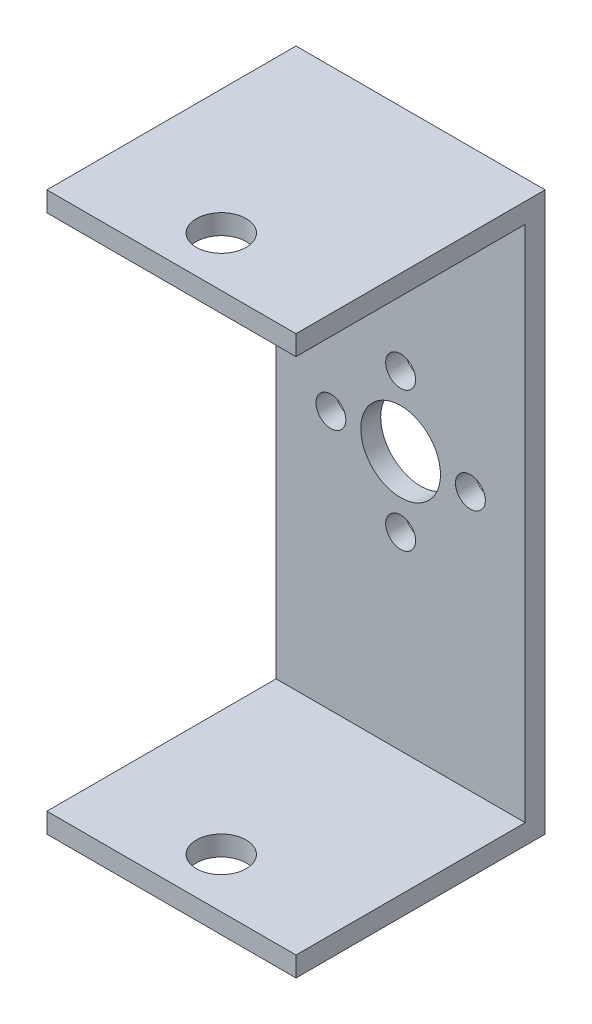
ISO-10303-21;
HEADER;
FILE_DESCRIPTION(('STEP AP214'),'2;1');
FILE_NAME('part.step','',(''),(''),'','','');
FILE_SCHEMA(('AUTOMOTIVE_DESIGN { 1 0 10303 214 1 1 1 1 }'));
ENDSEC;
DATA;
#1=APPLICATION_CONTEXT('core data for automotive mechanical design processes');
#2=APPLICATION_PROTOCOL_DEFINITION('international standard','automotive_design',2000,#1);
#3=PRODUCT_CONTEXT('',#1,'mechanical');
#4=PRODUCT('Part','Part','',(#3));
#5=PRODUCT_RELATED_PRODUCT_CATEGORY('part','',(#4));
#6=PRODUCT_DEFINITION_FORMATION('','',#4);
#7=PRODUCT_DEFINITION_CONTEXT('part definition',#1,'design');
#8=PRODUCT_DEFINITION('design','',#6,#7);
#9=PRODUCT_DEFINITION_SHAPE('','',#8);
#10=(LENGTH_UNIT() NAMED_UNIT(*) SI_UNIT(.MILLI.,.METRE.));
#11=(NAMED_UNIT(*) PLANE_ANGLE_UNIT() SI_UNIT($,.RADIAN.));
#12=(NAMED_UNIT(*) SI_UNIT($,.STERADIAN.) SOLID_ANGLE_UNIT());
#13=UNCERTAINTY_MEASURE_WITH_UNIT(LENGTH_MEASURE(1.E-05),#10,'distance_accuracy_value','');
#14=(GEOMETRIC_REPRESENTATION_CONTEXT(3) GLOBAL_UNCERTAINTY_ASSIGNED_CONTEXT((#13)) GLOBAL_UNIT_ASSIGNED_CONTEXT((#10,
#11,#12)) REPRESENTATION_CONTEXT('',''));
#15=CARTESIAN_POINT('',(0.,0.,0.));
#16=DIRECTION('',(0.,0.,1.));
#17=DIRECTION('',(1.,0.,0.));
#18=AXIS2_PLACEMENT_3D('',#15,#16,#17);
#19=CARTESIAN_POINT('',(-12.6747704507397,30.5029426241211,2.));
#20=DIRECTION('',(1.,0.,0.));
#21=DIRECTION('',(0.,1.,0.));
#22=AXIS2_PLACEMENT_3D('',#19,#20,#21);
#23=PLANE('',#22);
#24=DIRECTION('',(0.,-1.,0.));
#25=VECTOR('',#24,1.);
#26=CARTESIAN_POINT('',(-12.6747704507397,30.5029426241211,0.));
#27=LINE('',#26,#25);
#28=CARTESIAN_POINT('',(-12.6747704507397,32.5029426241211,0.));
#29=VERTEX_POINT('',#28);
#30=CARTESIAN_POINT('',(-12.6747704507397,-23.4970573758789,0.));
#31=VERTEX_POINT('',#30);
#32=EDGE_CURVE('E148',#29,#31,#27,.T.);
#33=ORIENTED_EDGE('',*,*,#32,.T.);
#34=DIRECTION('',(0.,0.,-1.));
#35=VECTOR('',#34,1.);
#36=CARTESIAN_POINT('',(-12.6747704507397,-23.4970573758789,0.));
#37=LINE('',#36,#35);
#38=CARTESIAN_POINT('',(-12.6747704507397,-23.4970573758789,25.));
#39=VERTEX_POINT('',#38);
#40=EDGE_CURVE('E107',#39,#31,#37,.T.);
#41=ORIENTED_EDGE('',*,*,#40,.F.);
#42=DIRECTION('',(0.,1.,0.));
#43=VECTOR('',#42,1.);
#44=CARTESIAN_POINT('',(-12.6747704507397,-23.4970573758789,25.));
#45=LINE('',#44,#43);
#46=CARTESIAN_POINT('',(-12.6747704507397,-21.4970573758789,25.));
#47=VERTEX_POINT('',#46);
#48=EDGE_CURVE('E103',#39,#47,#45,.T.);
#49=ORIENTED_EDGE('',*,*,#48,.T.);
#50=DIRECTION('',(0.,0.,-1.));
#51=VECTOR('',#50,1.);
#52=CARTESIAN_POINT('',(-12.6747704507397,-21.4970573758789,0.));
#53=LINE('',#52,#51);
#54=CARTESIAN_POINT('',(-12.6747704507397,-21.4970573758789,2.));
#55=VERTEX_POINT('',#54);
#56=EDGE_CURVE('E116',#47,#55,#53,.T.);
#57=ORIENTED_EDGE('',*,*,#56,.T.);
#58=DIRECTION('',(0.,-1.,0.));
#59=VECTOR('',#58,1.);
#60=CARTESIAN_POINT('',(-12.6747704507397,30.5029426241211,2.));
#61=LINE('',#60,#59);
#62=CARTESIAN_POINT('',(-12.6747704507397,30.5029426241211,2.));
#63=VERTEX_POINT('',#62);
#64=EDGE_CURVE('E141',#63,#55,#61,.T.);
#65=ORIENTED_EDGE('',*,*,#64,.F.);
#66=DIRECTION('',(0.,0.,1.));
#67=VECTOR('',#66,1.);
#68=CARTESIAN_POINT('',(-12.6747704507397,30.5029426241211,0.));
#69=LINE('',#68,#67);
#70=CARTESIAN_POINT('',(-12.6747704507397,30.5029426241211,25.));
#71=VERTEX_POINT('',#70);
#72=EDGE_CURVE('E48',#63,#71,#69,.T.);
#73=ORIENTED_EDGE('',*,*,#72,.T.);
#74=DIRECTION('',(0.,-1.,0.));
#75=VECTOR('',#74,1.);
#76=CARTESIAN_POINT('',(-12.6747704507397,32.5029426241211,25.));
#77=LINE('',#76,#75);
#78=CARTESIAN_POINT('',(-12.6747704507397,32.5029426241211,25.));
#79=VERTEX_POINT('',#78);
#80=EDGE_CURVE('E163',#79,#71,#77,.T.);
#81=ORIENTED_EDGE('',*,*,#80,.F.);
#82=DIRECTION('',(0.,0.,1.));
#83=VECTOR('',#82,1.);
#84=CARTESIAN_POINT('',(-12.6747704507397,32.5029426241211,0.));
#85=LINE('',#84,#83);
#86=EDGE_CURVE('E181',#29,#79,#85,.T.);
#87=ORIENTED_EDGE('',*,*,#86,.F.);
#88=EDGE_LOOP('',(#33,#41,#49,#57,#65,#73,#81,#87));
#89=FACE_BOUND('',#88,.T.);
#90=ADVANCED_FACE('F32',(#89),#23,.F.);
#91=CARTESIAN_POINT('',(12.3252295492603,30.5029426241211,2.));
#92=DIRECTION('',(-1.,0.,0.));
#93=DIRECTION('',(0.,-1.,0.));
#94=AXIS2_PLACEMENT_3D('',#91,#92,#93);
#95=PLANE('',#94);
#96=DIRECTION('',(0.,1.,0.));
#97=VECTOR('',#96,1.);
#98=CARTESIAN_POINT('',(12.3252295492603,30.5029426241211,0.));
#99=LINE('',#98,#97);
#100=CARTESIAN_POINT('',(12.3252295492603,-23.4970573758789,0.));
#101=VERTEX_POINT('',#100);
#102=CARTESIAN_POINT('',(12.3252295492603,32.5029426241211,0.));
#103=VERTEX_POINT('',#102);
#104=EDGE_CURVE('E146',#101,#103,#99,.T.);
#105=ORIENTED_EDGE('',*,*,#104,.T.);
#106=DIRECTION('',(0.,0.,-1.));
#107=VECTOR('',#106,1.);
#108=CARTESIAN_POINT('',(12.3252295492603,32.5029426241211,0.));
#109=LINE('',#108,#107);
#110=CARTESIAN_POINT('',(12.3252295492603,32.5029426241211,25.));
#111=VERTEX_POINT('',#110);
#112=EDGE_CURVE('E187',#111,#103,#109,.T.);
#113=ORIENTED_EDGE('',*,*,#112,.F.);
#114=DIRECTION('',(0.,-1.,0.));
#115=VECTOR('',#114,1.);
#116=CARTESIAN_POINT('',(12.3252295492603,32.5029426241211,25.));
#117=LINE('',#116,#115);
#118=CARTESIAN_POINT('',(12.3252295492603,30.5029426241211,25.));
#119=VERTEX_POINT('',#118);
#120=EDGE_CURVE('E166',#111,#119,#117,.T.);
#121=ORIENTED_EDGE('',*,*,#120,.T.);
#122=DIRECTION('',(0.,0.,-1.));
#123=VECTOR('',#122,1.);
#124=CARTESIAN_POINT('',(12.3252295492603,30.5029426241211,0.));
#125=LINE('',#124,#123);
#126=CARTESIAN_POINT('',(12.3252295492603,30.5029426241211,2.));
#127=VERTEX_POINT('',#126);
#128=EDGE_CURVE('E159',#119,#127,#125,.T.);
#129=ORIENTED_EDGE('',*,*,#128,.T.);
#130=DIRECTION('',(0.,1.,0.));
#131=VECTOR('',#130,1.);
#132=CARTESIAN_POINT('',(12.3252295492603,30.5029426241211,2.));
#133=LINE('',#132,#131);
#134=CARTESIAN_POINT('',(12.3252295492603,-21.4970573758789,2.));
#135=VERTEX_POINT('',#134);
#136=EDGE_CURVE('E40',#135,#127,#133,.T.);
#137=ORIENTED_EDGE('',*,*,#136,.F.);
#138=DIRECTION('',(0.,0.,1.));
#139=VECTOR('',#138,1.);
#140=CARTESIAN_POINT('',(12.3252295492603,-21.4970573758789,0.));
#141=LINE('',#140,#139);
#142=CARTESIAN_POINT('',(12.3252295492603,-21.4970573758789,25.));
#143=VERTEX_POINT('',#142);
#144=EDGE_CURVE('E55',#135,#143,#141,.T.);
#145=ORIENTED_EDGE('',*,*,#144,.T.);
#146=DIRECTION('',(0.,1.,0.));
#147=VECTOR('',#146,1.);
#148=CARTESIAN_POINT('',(12.3252295492603,-23.4970573758789,25.));
#149=LINE('',#148,#147);
#150=CARTESIAN_POINT('',(12.3252295492603,-23.4970573758789,25.));
#151=VERTEX_POINT('',#150);
#152=EDGE_CURVE('E101',#151,#143,#149,.T.);
#153=ORIENTED_EDGE('',*,*,#152,.F.);
#154=DIRECTION('',(0.,0.,1.));
#155=VECTOR('',#154,1.);
#156=CARTESIAN_POINT('',(12.3252295492603,-23.4970573758789,0.));
#157=LINE('',#156,#155);
#158=EDGE_CURVE('E108',#101,#151,#157,.T.);
#159=ORIENTED_EDGE('',*,*,#158,.F.);
#160=EDGE_LOOP('',(#105,#113,#121,#129,#137,#145,#153,#159));
#161=FACE_BOUND('',#160,.T.);
#162=ADVANCED_FACE('F118',(#161),#95,.F.);
#163=CARTESIAN_POINT('',(0.,0.,2.));
#164=DIRECTION('',(0.,0.,1.));
#165=DIRECTION('',(1.,0.,0.));
#166=AXIS2_PLACEMENT_3D('',#163,#164,#165);
#167=PLANE('',#166);
#168=CARTESIAN_POINT('',(-0.174770450739801,11.5029426241211,2.));
#169=DIRECTION('',(0.,0.,1.));
#170=DIRECTION('',(1.,0.,0.));
#171=AXIS2_PLACEMENT_3D('',#168,#169,#170);
#172=CIRCLE('',#171,1.5);
#173=CARTESIAN_POINT('',(1.3252295492602,11.5029426241211,2.));
#174=VERTEX_POINT('',#173);
#175=EDGE_CURVE('E335',#174,#174,#172,.T.);
#176=ORIENTED_EDGE('',*,*,#175,.F.);
#177=EDGE_LOOP('',(#176));
#178=FACE_BOUND('',#177,.T.);
#179=CARTESIAN_POINT('',(6.82522954926027,4.50294262412115,2.));
#180=DIRECTION('',(0.,0.,1.));
#181=DIRECTION('',(1.,0.,0.));
#182=AXIS2_PLACEMENT_3D('',#179,#180,#181);
#183=CIRCLE('',#182,1.5);
#184=CARTESIAN_POINT('',(8.32522954926028,4.50294262412115,2.));
#185=VERTEX_POINT('',#184);
#186=EDGE_CURVE('E329',#185,#185,#183,.T.);
#187=ORIENTED_EDGE('',*,*,#186,.F.);
#188=EDGE_LOOP('',(#187));
#189=FACE_BOUND('',#188,.T.);
#190=CARTESIAN_POINT('',(-0.174770450739701,-2.4970573758789,2.));
#191=DIRECTION('',(0.,0.,1.));
#192=DIRECTION('',(1.,0.,0.));
#193=AXIS2_PLACEMENT_3D('',#190,#191,#192);
#194=CIRCLE('',#193,1.5);
#195=CARTESIAN_POINT('',(1.3252295492603,-2.4970573758789,2.));
#196=VERTEX_POINT('',#195);
#197=EDGE_CURVE('E323',#196,#196,#194,.T.);
#198=ORIENTED_EDGE('',*,*,#197,.F.);
#199=EDGE_LOOP('',(#198));
#200=FACE_BOUND('',#199,.T.);
#201=CARTESIAN_POINT('',(-7.17477045073973,4.5029426241211,2.));
#202=DIRECTION('',(0.,0.,1.));
#203=DIRECTION('',(1.,0.,0.));
#204=AXIS2_PLACEMENT_3D('',#201,#202,#203);
#205=CIRCLE('',#204,1.5);
#206=CARTESIAN_POINT('',(-5.67477045073973,4.5029426241211,2.));
#207=VERTEX_POINT('',#206);
#208=EDGE_CURVE('E314',#207,#207,#205,.T.);
#209=ORIENTED_EDGE('',*,*,#208,.F.);
#210=EDGE_LOOP('',(#209));
#211=FACE_BOUND('',#210,.T.);
#212=CARTESIAN_POINT('',(-0.174770450739726,4.5029426241211,2.));
#213=DIRECTION('',(0.,0.,1.));
#214=DIRECTION('',(1.,0.,0.));
#215=AXIS2_PLACEMENT_3D('',#212,#213,#214);
#216=CIRCLE('',#215,4.);
#217=CARTESIAN_POINT('',(3.82522954926027,4.5029426241211,2.));
#218=VERTEX_POINT('',#217);
#219=EDGE_CURVE('E129',#218,#218,#216,.T.);
#220=ORIENTED_EDGE('',*,*,#219,.F.);
#221=EDGE_LOOP('',(#220));
#222=FACE_BOUND('',#221,.T.);
#223=ORIENTED_EDGE('',*,*,#64,.T.);
#224=DIRECTION('',(1.,0.,0.));
#225=VECTOR('',#224,1.);
#226=CARTESIAN_POINT('',(-12.6747704507397,-21.4970573758789,2.));
#227=LINE('',#226,#225);
#228=EDGE_CURVE('E145',#55,#135,#227,.T.);
#229=ORIENTED_EDGE('',*,*,#228,.T.);
#230=ORIENTED_EDGE('',*,*,#136,.T.);
#231=DIRECTION('',(-1.,0.,0.));
#232=VECTOR('',#231,1.);
#233=CARTESIAN_POINT('',(-12.6747704507397,30.5029426241211,2.));
#234=LINE('',#233,#232);
#235=EDGE_CURVE('E11',#127,#63,#234,.T.);
#236=ORIENTED_EDGE('',*,*,#235,.T.);
#237=EDGE_LOOP('',(#223,#229,#230,#236));
#238=FACE_BOUND('',#237,.T.);
#239=ADVANCED_FACE('F143',(#178,#189,#200,#211,#222,#238),#167,.T.);
#240=CARTESIAN_POINT('',(0.,0.,0.));
#241=DIRECTION('',(0.,0.,1.));
#242=DIRECTION('',(1.,0.,0.));
#243=AXIS2_PLACEMENT_3D('',#240,#241,#242);
#244=PLANE('',#243);
#245=CARTESIAN_POINT('',(-0.174770450739801,11.5029426241211,0.));
#246=DIRECTION('',(0.,0.,-1.));
#247=DIRECTION('',(-1.,0.,0.));
#248=AXIS2_PLACEMENT_3D('',#245,#246,#247);
#249=CIRCLE('',#248,1.5);
#250=CARTESIAN_POINT('',(-1.6747704507398,11.5029426241211,0.));
#251=VERTEX_POINT('',#250);
#252=EDGE_CURVE('E338',#251,#251,#249,.T.);
#253=ORIENTED_EDGE('',*,*,#252,.F.);
#254=EDGE_LOOP('',(#253));
#255=FACE_BOUND('',#254,.T.);
#256=CARTESIAN_POINT('',(6.82522954926027,4.50294262412115,0.));
#257=DIRECTION('',(0.,0.,-1.));
#258=DIRECTION('',(-1.,0.,0.));
#259=AXIS2_PLACEMENT_3D('',#256,#257,#258);
#260=CIRCLE('',#259,1.5);
#261=CARTESIAN_POINT('',(5.32522954926027,4.50294262412115,0.));
#262=VERTEX_POINT('',#261);
#263=EDGE_CURVE('E332',#262,#262,#260,.T.);
#264=ORIENTED_EDGE('',*,*,#263,.F.);
#265=EDGE_LOOP('',(#264));
#266=FACE_BOUND('',#265,.T.);
#267=CARTESIAN_POINT('',(-0.174770450739701,-2.4970573758789,0.));
#268=DIRECTION('',(0.,0.,-1.));
#269=DIRECTION('',(-1.,0.,0.));
#270=AXIS2_PLACEMENT_3D('',#267,#268,#269);
#271=CIRCLE('',#270,1.5);
#272=CARTESIAN_POINT('',(-1.6747704507397,-2.4970573758789,0.));
#273=VERTEX_POINT('',#272);
#274=EDGE_CURVE('E326',#273,#273,#271,.T.);
#275=ORIENTED_EDGE('',*,*,#274,.F.);
#276=EDGE_LOOP('',(#275));
#277=FACE_BOUND('',#276,.T.);
#278=CARTESIAN_POINT('',(-7.17477045073973,4.5029426241211,0.));
#279=DIRECTION('',(0.,0.,-1.));
#280=DIRECTION('',(-1.,0.,0.));
#281=AXIS2_PLACEMENT_3D('',#278,#279,#280);
#282=CIRCLE('',#281,1.5);
#283=CARTESIAN_POINT('',(-8.67477045073973,4.5029426241211,0.));
#284=VERTEX_POINT('',#283);
#285=EDGE_CURVE('E318',#284,#284,#282,.T.);
#286=ORIENTED_EDGE('',*,*,#285,.F.);
#287=EDGE_LOOP('',(#286));
#288=FACE_BOUND('',#287,.T.);
#289=CARTESIAN_POINT('',(-0.174770450739726,4.5029426241211,0.));
#290=DIRECTION('',(0.,0.,-1.));
#291=DIRECTION('',(-1.,0.,0.));
#292=AXIS2_PLACEMENT_3D('',#289,#290,#291);
#293=CIRCLE('',#292,4.);
#294=CARTESIAN_POINT('',(-4.17477045073973,4.5029426241211,0.));
#295=VERTEX_POINT('',#294);
#296=EDGE_CURVE('E312',#295,#295,#293,.T.);
#297=ORIENTED_EDGE('',*,*,#296,.F.);
#298=EDGE_LOOP('',(#297));
#299=FACE_BOUND('',#298,.T.);
#300=ORIENTED_EDGE('',*,*,#32,.F.);
#301=DIRECTION('',(-1.,0.,0.));
#302=VECTOR('',#301,1.);
#303=CARTESIAN_POINT('',(-12.6747704507397,32.5029426241211,0.));
#304=LINE('',#303,#302);
#305=EDGE_CURVE('E171',#103,#29,#304,.T.);
#306=ORIENTED_EDGE('',*,*,#305,.F.);
#307=ORIENTED_EDGE('',*,*,#104,.F.);
#308=DIRECTION('',(1.,0.,0.));
#309=VECTOR('',#308,1.);
#310=CARTESIAN_POINT('',(12.3252295492603,-23.4970573758789,0.));
#311=LINE('',#310,#309);
#312=EDGE_CURVE('E114',#31,#101,#311,.T.);
#313=ORIENTED_EDGE('',*,*,#312,.F.);
#314=EDGE_LOOP('',(#300,#306,#307,#313));
#315=FACE_BOUND('',#314,.T.);
#316=ADVANCED_FACE('F215',(#255,#266,#277,#288,#299,#315),#244,.F.);
#317=CARTESIAN_POINT('',(-12.6747704507397,32.5029426241211,25.));
#318=DIRECTION('',(0.,0.,-1.));
#319=DIRECTION('',(-1.,0.,0.));
#320=AXIS2_PLACEMENT_3D('',#317,#318,#319);
#321=PLANE('',#320);
#322=DIRECTION('',(1.,0.,0.));
#323=VECTOR('',#322,1.);
#324=CARTESIAN_POINT('',(-12.6747704507397,30.5029426241211,25.));
#325=LINE('',#324,#323);
#326=EDGE_CURVE('E121',#71,#119,#325,.T.);
#327=ORIENTED_EDGE('',*,*,#326,.T.);
#328=ORIENTED_EDGE('',*,*,#120,.F.);
#329=DIRECTION('',(1.,0.,0.));
#330=VECTOR('',#329,1.);
#331=CARTESIAN_POINT('',(-12.6747704507397,32.5029426241211,25.));
#332=LINE('',#331,#330);
#333=EDGE_CURVE('E184',#79,#111,#332,.T.);
#334=ORIENTED_EDGE('',*,*,#333,.F.);
#335=ORIENTED_EDGE('',*,*,#80,.T.);
#336=EDGE_LOOP('',(#327,#328,#334,#335));
#337=FACE_BOUND('',#336,.T.);
#338=ADVANCED_FACE('F203',(#337),#321,.F.);
#339=CARTESIAN_POINT('',(0.,32.5029426241211,0.));
#340=DIRECTION('',(0.,1.,0.));
#341=DIRECTION('',(0.,0.,1.));
#342=AXIS2_PLACEMENT_3D('',#339,#340,#341);
#343=PLANE('',#342);
#344=CARTESIAN_POINT('',(-0.174770450739721,32.5029426241211,20.));
#345=DIRECTION('',(0.,1.,0.));
#346=DIRECTION('',(0.,0.,1.));
#347=AXIS2_PLACEMENT_3D('',#344,#345,#346);
#348=CIRCLE('',#347,2.5);
#349=CARTESIAN_POINT('',(-0.174770450739721,32.5029426241211,22.5));
#350=VERTEX_POINT('',#349);
#351=EDGE_CURVE('E341',#350,#350,#348,.T.);
#352=ORIENTED_EDGE('',*,*,#351,.F.);
#353=EDGE_LOOP('',(#352));
#354=FACE_BOUND('',#353,.T.);
#355=ORIENTED_EDGE('',*,*,#86,.T.);
#356=ORIENTED_EDGE('',*,*,#333,.T.);
#357=ORIENTED_EDGE('',*,*,#112,.T.);
#358=ORIENTED_EDGE('',*,*,#305,.T.);
#359=EDGE_LOOP('',(#355,#356,#357,#358));
#360=FACE_BOUND('',#359,.T.);
#361=ADVANCED_FACE('F192',(#354,#360),#343,.T.);
#362=CARTESIAN_POINT('',(0.,30.5029426241211,0.));
#363=DIRECTION('',(0.,1.,0.));
#364=DIRECTION('',(0.,0.,1.));
#365=AXIS2_PLACEMENT_3D('',#362,#363,#364);
#366=PLANE('',#365);
#367=CARTESIAN_POINT('',(-0.174770450739721,30.5029426241211,20.));
#368=DIRECTION('',(0.,1.,0.));
#369=DIRECTION('',(0.,0.,1.));
#370=AXIS2_PLACEMENT_3D('',#367,#368,#369);
#371=CIRCLE('',#370,2.5);
#372=CARTESIAN_POINT('',(-0.174770450739721,30.5029426241211,22.5));
#373=VERTEX_POINT('',#372);
#374=EDGE_CURVE('E343',#373,#373,#371,.T.);
#375=ORIENTED_EDGE('',*,*,#374,.T.);
#376=EDGE_LOOP('',(#375));
#377=FACE_BOUND('',#376,.T.);
#378=ORIENTED_EDGE('',*,*,#235,.F.);
#379=ORIENTED_EDGE('',*,*,#128,.F.);
#380=ORIENTED_EDGE('',*,*,#326,.F.);
#381=ORIENTED_EDGE('',*,*,#72,.F.);
#382=EDGE_LOOP('',(#378,#379,#380,#381));
#383=FACE_BOUND('',#382,.T.);
#384=ADVANCED_FACE('F194',(#377,#383),#366,.F.);
#385=CARTESIAN_POINT('',(12.3252295492603,-23.4970573758789,25.));
#386=DIRECTION('',(0.,0.,-1.));
#387=DIRECTION('',(-1.,0.,0.));
#388=AXIS2_PLACEMENT_3D('',#385,#386,#387);
#389=PLANE('',#388);
#390=DIRECTION('',(-1.,0.,0.));
#391=VECTOR('',#390,1.);
#392=CARTESIAN_POINT('',(12.3252295492603,-21.4970573758789,25.));
#393=LINE('',#392,#391);
#394=EDGE_CURVE('E128',#143,#47,#393,.T.);
#395=ORIENTED_EDGE('',*,*,#394,.T.);
#396=ORIENTED_EDGE('',*,*,#48,.F.);
#397=DIRECTION('',(-1.,0.,0.));
#398=VECTOR('',#397,1.);
#399=CARTESIAN_POINT('',(12.3252295492603,-23.4970573758789,25.));
#400=LINE('',#399,#398);
#401=EDGE_CURVE('E97',#151,#39,#400,.T.);
#402=ORIENTED_EDGE('',*,*,#401,.F.);
#403=ORIENTED_EDGE('',*,*,#152,.T.);
#404=EDGE_LOOP('',(#395,#396,#402,#403));
#405=FACE_BOUND('',#404,.T.);
#406=ADVANCED_FACE('F99',(#405),#389,.F.);
#407=CARTESIAN_POINT('',(0.,-23.4970573758789,0.));
#408=DIRECTION('',(0.,-1.,0.));
#409=DIRECTION('',(0.,0.,-1.));
#410=AXIS2_PLACEMENT_3D('',#407,#408,#409);
#411=PLANE('',#410);
#412=CARTESIAN_POINT('',(-0.174770450739721,-23.4970573758789,20.));
#413=DIRECTION('',(0.,-1.,0.));
#414=DIRECTION('',(0.,0.,-1.));
#415=AXIS2_PLACEMENT_3D('',#412,#413,#414);
#416=CIRCLE('',#415,2.5);
#417=CARTESIAN_POINT('',(-0.174770450739721,-23.4970573758789,17.5));
#418=VERTEX_POINT('',#417);
#419=EDGE_CURVE('E345',#418,#418,#416,.T.);
#420=ORIENTED_EDGE('',*,*,#419,.F.);
#421=EDGE_LOOP('',(#420));
#422=FACE_BOUND('',#421,.T.);
#423=ORIENTED_EDGE('',*,*,#158,.T.);
#424=ORIENTED_EDGE('',*,*,#401,.T.);
#425=ORIENTED_EDGE('',*,*,#40,.T.);
#426=ORIENTED_EDGE('',*,*,#312,.T.);
#427=EDGE_LOOP('',(#423,#424,#425,#426));
#428=FACE_BOUND('',#427,.T.);
#429=ADVANCED_FACE('F112',(#422,#428),#411,.T.);
#430=CARTESIAN_POINT('',(0.,-21.4970573758789,0.));
#431=DIRECTION('',(0.,-1.,0.));
#432=DIRECTION('',(0.,0.,-1.));
#433=AXIS2_PLACEMENT_3D('',#430,#431,#432);
#434=PLANE('',#433);
#435=CARTESIAN_POINT('',(-0.174770450739721,-21.4970573758789,20.));
#436=DIRECTION('',(0.,-1.,0.));
#437=DIRECTION('',(0.,0.,-1.));
#438=AXIS2_PLACEMENT_3D('',#435,#436,#437);
#439=CIRCLE('',#438,2.5);
#440=CARTESIAN_POINT('',(-0.174770450739721,-21.4970573758789,17.5));
#441=VERTEX_POINT('',#440);
#442=EDGE_CURVE('E35',#441,#441,#439,.T.);
#443=ORIENTED_EDGE('',*,*,#442,.T.);
#444=EDGE_LOOP('',(#443));
#445=FACE_BOUND('',#444,.T.);
#446=ORIENTED_EDGE('',*,*,#228,.F.);
#447=ORIENTED_EDGE('',*,*,#56,.F.);
#448=ORIENTED_EDGE('',*,*,#394,.F.);
#449=ORIENTED_EDGE('',*,*,#144,.F.);
#450=EDGE_LOOP('',(#446,#447,#448,#449));
#451=FACE_BOUND('',#450,.T.);
#452=ADVANCED_FACE('F250',(#445,#451),#434,.F.);
#453=CARTESIAN_POINT('',(-0.174770450739726,4.5029426241211,21.));
#454=DIRECTION('',(0.,0.,-1.));
#455=DIRECTION('',(-1.,0.,0.));
#456=AXIS2_PLACEMENT_3D('',#453,#454,#455);
#457=CYLINDRICAL_SURFACE('',#456,4.);
#458=ORIENTED_EDGE('',*,*,#219,.T.);
#459=EDGE_LOOP('',(#458));
#460=FACE_BOUND('',#459,.T.);
#461=ORIENTED_EDGE('',*,*,#296,.T.);
#462=EDGE_LOOP('',(#461));
#463=FACE_BOUND('',#462,.T.);
#464=ADVANCED_FACE('F261',(#460,#463),#457,.F.);
#465=CARTESIAN_POINT('',(-7.17477045073973,4.5029426241211,21.));
#466=DIRECTION('',(0.,0.,-1.));
#467=DIRECTION('',(-1.,0.,0.));
#468=AXIS2_PLACEMENT_3D('',#465,#466,#467);
#469=CYLINDRICAL_SURFACE('',#468,1.5);
#470=ORIENTED_EDGE('',*,*,#208,.T.);
#471=EDGE_LOOP('',(#470));
#472=FACE_BOUND('',#471,.T.);
#473=ORIENTED_EDGE('',*,*,#285,.T.);
#474=EDGE_LOOP('',(#473));
#475=FACE_BOUND('',#474,.T.);
#476=ADVANCED_FACE('F299',(#472,#475),#469,.F.);
#477=CARTESIAN_POINT('',(-0.174770450739701,-2.4970573758789,21.));
#478=DIRECTION('',(0.,0.,-1.));
#479=DIRECTION('',(-1.,0.,0.));
#480=AXIS2_PLACEMENT_3D('',#477,#478,#479);
#481=CYLINDRICAL_SURFACE('',#480,1.5);
#482=ORIENTED_EDGE('',*,*,#197,.T.);
#483=EDGE_LOOP('',(#482));
#484=FACE_BOUND('',#483,.T.);
#485=ORIENTED_EDGE('',*,*,#274,.T.);
#486=EDGE_LOOP('',(#485));
#487=FACE_BOUND('',#486,.T.);
#488=ADVANCED_FACE('F295',(#484,#487),#481,.F.);
#489=CARTESIAN_POINT('',(6.82522954926027,4.50294262412115,21.));
#490=DIRECTION('',(0.,0.,-1.));
#491=DIRECTION('',(-1.,0.,0.));
#492=AXIS2_PLACEMENT_3D('',#489,#490,#491);
#493=CYLINDRICAL_SURFACE('',#492,1.5);
#494=ORIENTED_EDGE('',*,*,#186,.T.);
#495=EDGE_LOOP('',(#494));
#496=FACE_BOUND('',#495,.T.);
#497=ORIENTED_EDGE('',*,*,#263,.T.);
#498=EDGE_LOOP('',(#497));
#499=FACE_BOUND('',#498,.T.);
#500=ADVANCED_FACE('F291',(#496,#499),#493,.F.);
#501=CARTESIAN_POINT('',(-0.174770450739801,11.5029426241211,21.));
#502=DIRECTION('',(0.,0.,-1.));
#503=DIRECTION('',(-1.,0.,0.));
#504=AXIS2_PLACEMENT_3D('',#501,#502,#503);
#505=CYLINDRICAL_SURFACE('',#504,1.5);
#506=ORIENTED_EDGE('',*,*,#175,.T.);
#507=EDGE_LOOP('',(#506));
#508=FACE_BOUND('',#507,.T.);
#509=ORIENTED_EDGE('',*,*,#252,.T.);
#510=EDGE_LOOP('',(#509));
#511=FACE_BOUND('',#510,.T.);
#512=ADVANCED_FACE('F236',(#508,#511),#505,.F.);
#513=CARTESIAN_POINT('',(-0.174770450739721,57.5029426241211,20.));
#514=DIRECTION('',(0.,-1.,0.));
#515=DIRECTION('',(0.,0.,-1.));
#516=AXIS2_PLACEMENT_3D('',#513,#514,#515);
#517=CYLINDRICAL_SURFACE('',#516,2.5);
#518=ORIENTED_EDGE('',*,*,#419,.T.);
#519=EDGE_LOOP('',(#518));
#520=FACE_BOUND('',#519,.T.);
#521=ORIENTED_EDGE('',*,*,#442,.F.);
#522=EDGE_LOOP('',(#521));
#523=FACE_BOUND('',#522,.T.);
#524=ADVANCED_FACE('F269',(#520,#523),#517,.F.);
#525=ORIENTED_EDGE('',*,*,#351,.T.);
#526=EDGE_LOOP('',(#525));
#527=FACE_BOUND('',#526,.T.);
#528=ORIENTED_EDGE('',*,*,#374,.F.);
#529=EDGE_LOOP('',(#528));
#530=FACE_BOUND('',#529,.T.);
#531=ADVANCED_FACE('F274',(#527,#530),#517,.F.);
#532=CLOSED_SHELL('',(#90,#162,#239,#316,#338,#361,#384,#406,#429,#452,#464,#476,#488,#500,#512,
#524,#531));
#533=MANIFOLD_SOLID_BREP('B2',#532);
#534=ADVANCED_BREP_SHAPE_REPRESENTATION('',(#18,#533),#14);
#535=SHAPE_DEFINITION_REPRESENTATION(#9,#534);
ENDSEC;
END-ISO-10303-21;
